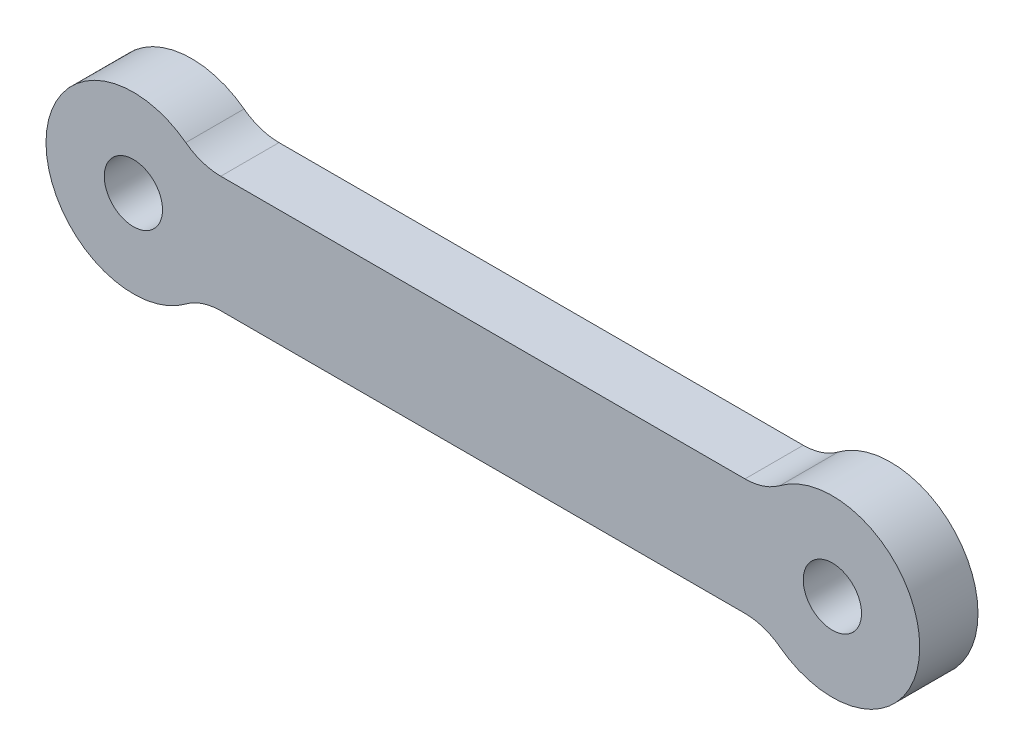
ISO-10303-21;
HEADER;
FILE_DESCRIPTION(('STEP AP214'),'2;1');
FILE_NAME('part.step','',(''),(''),'','','');
FILE_SCHEMA(('AUTOMOTIVE_DESIGN { 1 0 10303 214 1 1 1 1 }'));
ENDSEC;
DATA;
#1=APPLICATION_CONTEXT('core data for automotive mechanical design processes');
#2=APPLICATION_PROTOCOL_DEFINITION('international standard','automotive_design',2000,#1);
#3=PRODUCT_CONTEXT('',#1,'mechanical');
#4=PRODUCT('Part','Part','',(#3));
#5=PRODUCT_RELATED_PRODUCT_CATEGORY('part','',(#4));
#6=PRODUCT_DEFINITION_FORMATION('','',#4);
#7=PRODUCT_DEFINITION_CONTEXT('part definition',#1,'design');
#8=PRODUCT_DEFINITION('design','',#6,#7);
#9=PRODUCT_DEFINITION_SHAPE('','',#8);
#10=(LENGTH_UNIT() NAMED_UNIT(*) SI_UNIT(.MILLI.,.METRE.));
#11=(NAMED_UNIT(*) PLANE_ANGLE_UNIT() SI_UNIT($,.RADIAN.));
#12=(NAMED_UNIT(*) SI_UNIT($,.STERADIAN.) SOLID_ANGLE_UNIT());
#13=UNCERTAINTY_MEASURE_WITH_UNIT(LENGTH_MEASURE(1.E-05),#10,'distance_accuracy_value','');
#14=(GEOMETRIC_REPRESENTATION_CONTEXT(3) GLOBAL_UNCERTAINTY_ASSIGNED_CONTEXT((#13)) GLOBAL_UNIT_ASSIGNED_CONTEXT((#10,
#11,#12)) REPRESENTATION_CONTEXT('',''));
#15=CARTESIAN_POINT('',(0.,0.,0.));
#16=DIRECTION('',(0.,0.,1.));
#17=DIRECTION('',(1.,0.,0.));
#18=AXIS2_PLACEMENT_3D('',#15,#16,#17);
#19=CARTESIAN_POINT('',(-66.675,-12.7,3.175));
#20=DIRECTION('',(0.,0.,1.));
#21=DIRECTION('',(1.,0.,0.));
#22=AXIS2_PLACEMENT_3D('',#19,#20,#21);
#23=PLANE('',#22);
#24=CARTESIAN_POINT('',(0.,0.,3.175));
#25=DIRECTION('',(0.,0.,1.));
#26=DIRECTION('',(1.,0.,0.));
#27=AXIS2_PLACEMENT_3D('',#24,#25,#26);
#28=CIRCLE('',#27,3.175);
#29=CARTESIAN_POINT('',(3.175,0.,3.175));
#30=VERTEX_POINT('',#29);
#31=EDGE_CURVE('E134',#30,#30,#28,.T.);
#32=ORIENTED_EDGE('',*,*,#31,.F.);
#33=EDGE_LOOP('',(#32));
#34=FACE_BOUND('',#33,.T.);
#35=CARTESIAN_POINT('',(-66.675,-12.7,3.175));
#36=DIRECTION('',(0.,0.,-1.));
#37=DIRECTION('',(1.,0.,0.));
#38=AXIS2_PLACEMENT_3D('',#35,#36,#37);
#39=CIRCLE('',#38,6.35);
#40=CARTESIAN_POINT('',(-70.485,-7.62,3.175));
#41=VERTEX_POINT('',#40);
#42=CARTESIAN_POINT('',(-66.675,-6.35,3.175));
#43=VERTEX_POINT('',#42);
#44=EDGE_CURVE('E145',#41,#43,#39,.T.);
#45=ORIENTED_EDGE('',*,*,#44,.T.);
#46=DIRECTION('',(1.,0.,0.));
#47=VECTOR('',#46,1.);
#48=CARTESIAN_POINT('',(-9.525,-6.35,3.175));
#49=LINE('',#48,#47);
#50=CARTESIAN_POINT('',(-9.525,-6.35,3.175));
#51=VERTEX_POINT('',#50);
#52=EDGE_CURVE('E93',#43,#51,#49,.T.);
#53=ORIENTED_EDGE('',*,*,#52,.T.);
#54=CARTESIAN_POINT('',(-9.525,-12.7,3.175));
#55=DIRECTION('',(0.,0.,-1.));
#56=DIRECTION('',(-1.,0.,0.));
#57=AXIS2_PLACEMENT_3D('',#54,#55,#56);
#58=CIRCLE('',#57,6.35);
#59=CARTESIAN_POINT('',(-5.715,-7.62,3.175));
#60=VERTEX_POINT('',#59);
#61=EDGE_CURVE('E160',#51,#60,#58,.T.);
#62=ORIENTED_EDGE('',*,*,#61,.T.);
#63=CARTESIAN_POINT('',(0.,0.,3.175));
#64=DIRECTION('',(0.,0.,1.));
#65=DIRECTION('',(1.,0.,0.));
#66=AXIS2_PLACEMENT_3D('',#63,#64,#65);
#67=CIRCLE('',#66,9.525);
#68=CARTESIAN_POINT('',(-5.715,7.62,3.175));
#69=VERTEX_POINT('',#68);
#70=EDGE_CURVE('E173',#60,#69,#67,.T.);
#71=ORIENTED_EDGE('',*,*,#70,.T.);
#72=CARTESIAN_POINT('',(-9.525,12.7,3.175));
#73=DIRECTION('',(0.,0.,-1.));
#74=DIRECTION('',(1.,0.,0.));
#75=AXIS2_PLACEMENT_3D('',#72,#73,#74);
#76=CIRCLE('',#75,6.35);
#77=CARTESIAN_POINT('',(-9.525,6.35,3.175));
#78=VERTEX_POINT('',#77);
#79=EDGE_CURVE('E112',#69,#78,#76,.T.);
#80=ORIENTED_EDGE('',*,*,#79,.T.);
#81=DIRECTION('',(-1.,0.,0.));
#82=VECTOR('',#81,1.);
#83=CARTESIAN_POINT('',(-66.675,6.35,3.175));
#84=LINE('',#83,#82);
#85=CARTESIAN_POINT('',(-66.675,6.35,3.175));
#86=VERTEX_POINT('',#85);
#87=EDGE_CURVE('E106',#78,#86,#84,.T.);
#88=ORIENTED_EDGE('',*,*,#87,.T.);
#89=CARTESIAN_POINT('',(-66.675,12.7,3.175));
#90=DIRECTION('',(0.,0.,-1.));
#91=DIRECTION('',(-1.,0.,0.));
#92=AXIS2_PLACEMENT_3D('',#89,#90,#91);
#93=CIRCLE('',#92,6.35);
#94=CARTESIAN_POINT('',(-70.485,7.62,3.175));
#95=VERTEX_POINT('',#94);
#96=EDGE_CURVE('E110',#86,#95,#93,.T.);
#97=ORIENTED_EDGE('',*,*,#96,.T.);
#98=CARTESIAN_POINT('',(-76.2,0.,3.175));
#99=DIRECTION('',(0.,0.,1.));
#100=DIRECTION('',(1.,0.,0.));
#101=AXIS2_PLACEMENT_3D('',#98,#99,#100);
#102=CIRCLE('',#101,9.525);
#103=EDGE_CURVE('E50',#95,#41,#102,.T.);
#104=ORIENTED_EDGE('',*,*,#103,.T.);
#105=EDGE_LOOP('',(#45,#53,#62,#71,#80,#88,#97,#104));
#106=FACE_BOUND('',#105,.T.);
#107=CARTESIAN_POINT('',(-76.2,0.,3.175));
#108=DIRECTION('',(0.,0.,1.));
#109=DIRECTION('',(1.,0.,0.));
#110=AXIS2_PLACEMENT_3D('',#107,#108,#109);
#111=CIRCLE('',#110,3.175);
#112=CARTESIAN_POINT('',(-73.025,0.,3.175));
#113=VERTEX_POINT('',#112);
#114=EDGE_CURVE('E182',#113,#113,#111,.T.);
#115=ORIENTED_EDGE('',*,*,#114,.F.);
#116=EDGE_LOOP('',(#115));
#117=FACE_BOUND('',#116,.T.);
#118=ADVANCED_FACE('F33',(#34,#106,#117),#23,.T.);
#119=CARTESIAN_POINT('',(-66.675,-12.7,-3.175));
#120=DIRECTION('',(0.,0.,1.));
#121=DIRECTION('',(1.,0.,0.));
#122=AXIS2_PLACEMENT_3D('',#119,#120,#121);
#123=PLANE('',#122);
#124=CARTESIAN_POINT('',(-66.675,-12.7,-3.175));
#125=DIRECTION('',(0.,0.,-1.));
#126=DIRECTION('',(1.,0.,0.));
#127=AXIS2_PLACEMENT_3D('',#124,#125,#126);
#128=CIRCLE('',#127,6.35);
#129=CARTESIAN_POINT('',(-70.485,-7.62,-3.175));
#130=VERTEX_POINT('',#129);
#131=CARTESIAN_POINT('',(-66.675,-6.35,-3.175));
#132=VERTEX_POINT('',#131);
#133=EDGE_CURVE('E130',#130,#132,#128,.T.);
#134=ORIENTED_EDGE('',*,*,#133,.F.);
#135=CARTESIAN_POINT('',(-76.2,0.,-3.175));
#136=DIRECTION('',(0.,0.,1.));
#137=DIRECTION('',(1.,0.,0.));
#138=AXIS2_PLACEMENT_3D('',#135,#136,#137);
#139=CIRCLE('',#138,9.525);
#140=CARTESIAN_POINT('',(-70.485,7.62,-3.175));
#141=VERTEX_POINT('',#140);
#142=EDGE_CURVE('E85',#141,#130,#139,.T.);
#143=ORIENTED_EDGE('',*,*,#142,.F.);
#144=CARTESIAN_POINT('',(-66.675,12.7,-3.175));
#145=DIRECTION('',(0.,0.,-1.));
#146=DIRECTION('',(-1.,0.,0.));
#147=AXIS2_PLACEMENT_3D('',#144,#145,#146);
#148=CIRCLE('',#147,6.35);
#149=CARTESIAN_POINT('',(-66.675,6.35,-3.175));
#150=VERTEX_POINT('',#149);
#151=EDGE_CURVE('E79',#150,#141,#148,.T.);
#152=ORIENTED_EDGE('',*,*,#151,.F.);
#153=DIRECTION('',(-1.,0.,0.));
#154=VECTOR('',#153,1.);
#155=CARTESIAN_POINT('',(-66.675,6.35,-3.175));
#156=LINE('',#155,#154);
#157=CARTESIAN_POINT('',(-9.525,6.35,-3.175));
#158=VERTEX_POINT('',#157);
#159=EDGE_CURVE('E120',#158,#150,#156,.T.);
#160=ORIENTED_EDGE('',*,*,#159,.F.);
#161=CARTESIAN_POINT('',(-9.525,12.7,-3.175));
#162=DIRECTION('',(0.,0.,-1.));
#163=DIRECTION('',(1.,0.,0.));
#164=AXIS2_PLACEMENT_3D('',#161,#162,#163);
#165=CIRCLE('',#164,6.35);
#166=CARTESIAN_POINT('',(-5.715,7.62,-3.175));
#167=VERTEX_POINT('',#166);
#168=EDGE_CURVE('E140',#167,#158,#165,.T.);
#169=ORIENTED_EDGE('',*,*,#168,.F.);
#170=CARTESIAN_POINT('',(0.,0.,-3.175));
#171=DIRECTION('',(0.,0.,1.));
#172=DIRECTION('',(1.,0.,0.));
#173=AXIS2_PLACEMENT_3D('',#170,#171,#172);
#174=CIRCLE('',#173,9.525);
#175=CARTESIAN_POINT('',(-5.715,-7.62,-3.175));
#176=VERTEX_POINT('',#175);
#177=EDGE_CURVE('E138',#176,#167,#174,.T.);
#178=ORIENTED_EDGE('',*,*,#177,.F.);
#179=CARTESIAN_POINT('',(-9.525,-12.7,-3.175));
#180=DIRECTION('',(0.,0.,-1.));
#181=DIRECTION('',(-1.,0.,0.));
#182=AXIS2_PLACEMENT_3D('',#179,#180,#181);
#183=CIRCLE('',#182,6.35);
#184=CARTESIAN_POINT('',(-9.525,-6.35,-3.175));
#185=VERTEX_POINT('',#184);
#186=EDGE_CURVE('E136',#185,#176,#183,.T.);
#187=ORIENTED_EDGE('',*,*,#186,.F.);
#188=DIRECTION('',(1.,0.,0.));
#189=VECTOR('',#188,1.);
#190=CARTESIAN_POINT('',(-9.525,-6.35,-3.175));
#191=LINE('',#190,#189);
#192=EDGE_CURVE('E133',#132,#185,#191,.T.);
#193=ORIENTED_EDGE('',*,*,#192,.F.);
#194=EDGE_LOOP('',(#134,#143,#152,#160,#169,#178,#187,#193));
#195=FACE_BOUND('',#194,.T.);
#196=CARTESIAN_POINT('',(0.,0.,-3.175));
#197=DIRECTION('',(0.,0.,1.));
#198=DIRECTION('',(1.,0.,0.));
#199=AXIS2_PLACEMENT_3D('',#196,#197,#198);
#200=CIRCLE('',#199,3.175);
#201=CARTESIAN_POINT('',(3.175,0.,-3.175));
#202=VERTEX_POINT('',#201);
#203=EDGE_CURVE('E179',#202,#202,#200,.T.);
#204=ORIENTED_EDGE('',*,*,#203,.T.);
#205=EDGE_LOOP('',(#204));
#206=FACE_BOUND('',#205,.T.);
#207=CARTESIAN_POINT('',(-76.2,0.,-3.175));
#208=DIRECTION('',(0.,0.,1.));
#209=DIRECTION('',(1.,0.,0.));
#210=AXIS2_PLACEMENT_3D('',#207,#208,#209);
#211=CIRCLE('',#210,3.175);
#212=CARTESIAN_POINT('',(-73.025,0.,-3.175));
#213=VERTEX_POINT('',#212);
#214=EDGE_CURVE('E185',#213,#213,#211,.T.);
#215=ORIENTED_EDGE('',*,*,#214,.T.);
#216=EDGE_LOOP('',(#215));
#217=FACE_BOUND('',#216,.T.);
#218=ADVANCED_FACE('F164',(#195,#206,#217),#123,.F.);
#219=CARTESIAN_POINT('',(-66.675,-12.7,3.175));
#220=DIRECTION('',(0.,0.,-1.));
#221=DIRECTION('',(-1.,0.,0.));
#222=AXIS2_PLACEMENT_3D('',#219,#220,#221);
#223=CYLINDRICAL_SURFACE('',#222,6.35);
#224=ORIENTED_EDGE('',*,*,#133,.T.);
#225=DIRECTION('',(0.,0.,-1.));
#226=VECTOR('',#225,1.);
#227=CARTESIAN_POINT('',(-66.675,-6.35,3.175));
#228=LINE('',#227,#226);
#229=EDGE_CURVE('E11',#43,#132,#228,.T.);
#230=ORIENTED_EDGE('',*,*,#229,.F.);
#231=ORIENTED_EDGE('',*,*,#44,.F.);
#232=DIRECTION('',(0.,0.,-1.));
#233=VECTOR('',#232,1.);
#234=CARTESIAN_POINT('',(-70.485,-7.62,3.175));
#235=LINE('',#234,#233);
#236=EDGE_CURVE('E126',#41,#130,#235,.T.);
#237=ORIENTED_EDGE('',*,*,#236,.T.);
#238=EDGE_LOOP('',(#224,#230,#231,#237));
#239=FACE_BOUND('',#238,.T.);
#240=ADVANCED_FACE('F35',(#239),#223,.F.);
#241=CARTESIAN_POINT('',(-9.525,-6.35,3.175));
#242=DIRECTION('',(0.,1.,0.));
#243=DIRECTION('',(0.,0.,1.));
#244=AXIS2_PLACEMENT_3D('',#241,#242,#243);
#245=PLANE('',#244);
#246=ORIENTED_EDGE('',*,*,#192,.T.);
#247=DIRECTION('',(0.,0.,-1.));
#248=VECTOR('',#247,1.);
#249=CARTESIAN_POINT('',(-9.525,-6.35,3.175));
#250=LINE('',#249,#248);
#251=EDGE_CURVE('E42',#51,#185,#250,.T.);
#252=ORIENTED_EDGE('',*,*,#251,.F.);
#253=ORIENTED_EDGE('',*,*,#52,.F.);
#254=ORIENTED_EDGE('',*,*,#229,.T.);
#255=EDGE_LOOP('',(#246,#252,#253,#254));
#256=FACE_BOUND('',#255,.T.);
#257=ADVANCED_FACE('F217',(#256),#245,.F.);
#258=CARTESIAN_POINT('',(-9.525,-12.7,3.175));
#259=DIRECTION('',(0.,0.,-1.));
#260=DIRECTION('',(-1.,0.,0.));
#261=AXIS2_PLACEMENT_3D('',#258,#259,#260);
#262=CYLINDRICAL_SURFACE('',#261,6.35);
#263=ORIENTED_EDGE('',*,*,#186,.T.);
#264=DIRECTION('',(0.,0.,-1.));
#265=VECTOR('',#264,1.);
#266=CARTESIAN_POINT('',(-5.715,-7.62,3.175));
#267=LINE('',#266,#265);
#268=EDGE_CURVE('E152',#60,#176,#267,.T.);
#269=ORIENTED_EDGE('',*,*,#268,.F.);
#270=ORIENTED_EDGE('',*,*,#61,.F.);
#271=ORIENTED_EDGE('',*,*,#251,.T.);
#272=EDGE_LOOP('',(#263,#269,#270,#271));
#273=FACE_BOUND('',#272,.T.);
#274=ADVANCED_FACE('F158',(#273),#262,.F.);
#275=CARTESIAN_POINT('',(0.,0.,3.175));
#276=DIRECTION('',(0.,0.,-1.));
#277=DIRECTION('',(-1.,0.,0.));
#278=AXIS2_PLACEMENT_3D('',#275,#276,#277);
#279=CYLINDRICAL_SURFACE('',#278,9.525);
#280=ORIENTED_EDGE('',*,*,#177,.T.);
#281=DIRECTION('',(0.,0.,-1.));
#282=VECTOR('',#281,1.);
#283=CARTESIAN_POINT('',(-5.715,7.62,3.175));
#284=LINE('',#283,#282);
#285=EDGE_CURVE('E149',#69,#167,#284,.T.);
#286=ORIENTED_EDGE('',*,*,#285,.F.);
#287=ORIENTED_EDGE('',*,*,#70,.F.);
#288=ORIENTED_EDGE('',*,*,#268,.T.);
#289=EDGE_LOOP('',(#280,#286,#287,#288));
#290=FACE_BOUND('',#289,.T.);
#291=ADVANCED_FACE('F169',(#290),#279,.T.);
#292=CARTESIAN_POINT('',(-9.525,12.7,3.175));
#293=DIRECTION('',(0.,0.,-1.));
#294=DIRECTION('',(-1.,0.,0.));
#295=AXIS2_PLACEMENT_3D('',#292,#293,#294);
#296=CYLINDRICAL_SURFACE('',#295,6.35);
#297=ORIENTED_EDGE('',*,*,#168,.T.);
#298=DIRECTION('',(0.,0.,-1.));
#299=VECTOR('',#298,1.);
#300=CARTESIAN_POINT('',(-9.525,6.35,3.175));
#301=LINE('',#300,#299);
#302=EDGE_CURVE('E121',#78,#158,#301,.T.);
#303=ORIENTED_EDGE('',*,*,#302,.F.);
#304=ORIENTED_EDGE('',*,*,#79,.F.);
#305=ORIENTED_EDGE('',*,*,#285,.T.);
#306=EDGE_LOOP('',(#297,#303,#304,#305));
#307=FACE_BOUND('',#306,.T.);
#308=ADVANCED_FACE('F172',(#307),#296,.F.);
#309=CARTESIAN_POINT('',(-66.675,6.35,3.175));
#310=DIRECTION('',(0.,-1.,0.));
#311=DIRECTION('',(1.,0.,0.));
#312=AXIS2_PLACEMENT_3D('',#309,#310,#311);
#313=PLANE('',#312);
#314=ORIENTED_EDGE('',*,*,#159,.T.);
#315=DIRECTION('',(0.,0.,-1.));
#316=VECTOR('',#315,1.);
#317=CARTESIAN_POINT('',(-66.675,6.35,3.175));
#318=LINE('',#317,#316);
#319=EDGE_CURVE('E117',#86,#150,#318,.T.);
#320=ORIENTED_EDGE('',*,*,#319,.F.);
#321=ORIENTED_EDGE('',*,*,#87,.F.);
#322=ORIENTED_EDGE('',*,*,#302,.T.);
#323=EDGE_LOOP('',(#314,#320,#321,#322));
#324=FACE_BOUND('',#323,.T.);
#325=ADVANCED_FACE('F118',(#324),#313,.F.);
#326=CARTESIAN_POINT('',(-66.675,12.7,3.175));
#327=DIRECTION('',(0.,0.,-1.));
#328=DIRECTION('',(-1.,0.,0.));
#329=AXIS2_PLACEMENT_3D('',#326,#327,#328);
#330=CYLINDRICAL_SURFACE('',#329,6.35);
#331=ORIENTED_EDGE('',*,*,#151,.T.);
#332=DIRECTION('',(0.,0.,-1.));
#333=VECTOR('',#332,1.);
#334=CARTESIAN_POINT('',(-70.485,7.62,3.175));
#335=LINE('',#334,#333);
#336=EDGE_CURVE('E122',#95,#141,#335,.T.);
#337=ORIENTED_EDGE('',*,*,#336,.F.);
#338=ORIENTED_EDGE('',*,*,#96,.F.);
#339=ORIENTED_EDGE('',*,*,#319,.T.);
#340=EDGE_LOOP('',(#331,#337,#338,#339));
#341=FACE_BOUND('',#340,.T.);
#342=ADVANCED_FACE('F124',(#341),#330,.F.);
#343=CARTESIAN_POINT('',(-76.2,0.,3.175));
#344=DIRECTION('',(0.,0.,-1.));
#345=DIRECTION('',(-1.,0.,0.));
#346=AXIS2_PLACEMENT_3D('',#343,#344,#345);
#347=CYLINDRICAL_SURFACE('',#346,9.525);
#348=ORIENTED_EDGE('',*,*,#142,.T.);
#349=ORIENTED_EDGE('',*,*,#236,.F.);
#350=ORIENTED_EDGE('',*,*,#103,.F.);
#351=ORIENTED_EDGE('',*,*,#336,.T.);
#352=EDGE_LOOP('',(#348,#349,#350,#351));
#353=FACE_BOUND('',#352,.T.);
#354=ADVANCED_FACE('F205',(#353),#347,.T.);
#355=CARTESIAN_POINT('',(0.,0.,3.175));
#356=DIRECTION('',(0.,0.,-1.));
#357=DIRECTION('',(-1.,0.,0.));
#358=AXIS2_PLACEMENT_3D('',#355,#356,#357);
#359=CYLINDRICAL_SURFACE('',#358,3.175);
#360=ORIENTED_EDGE('',*,*,#31,.T.);
#361=EDGE_LOOP('',(#360));
#362=FACE_BOUND('',#361,.T.);
#363=ORIENTED_EDGE('',*,*,#203,.F.);
#364=EDGE_LOOP('',(#363));
#365=FACE_BOUND('',#364,.T.);
#366=ADVANCED_FACE('F202',(#362,#365),#359,.F.);
#367=CARTESIAN_POINT('',(-76.2,0.,3.175));
#368=DIRECTION('',(0.,0.,-1.));
#369=DIRECTION('',(-1.,0.,0.));
#370=AXIS2_PLACEMENT_3D('',#367,#368,#369);
#371=CYLINDRICAL_SURFACE('',#370,3.175);
#372=ORIENTED_EDGE('',*,*,#114,.T.);
#373=EDGE_LOOP('',(#372));
#374=FACE_BOUND('',#373,.T.);
#375=ORIENTED_EDGE('',*,*,#214,.F.);
#376=EDGE_LOOP('',(#375));
#377=FACE_BOUND('',#376,.T.);
#378=ADVANCED_FACE('F191',(#374,#377),#371,.F.);
#379=CLOSED_SHELL('',(#118,#218,#240,#257,#274,#291,#308,#325,#342,#354,#366,#378));
#380=MANIFOLD_SOLID_BREP('B2',#379);
#381=ADVANCED_BREP_SHAPE_REPRESENTATION('',(#18,#380),#14);
#382=SHAPE_DEFINITION_REPRESENTATION(#9,#381);
ENDSEC;
END-ISO-10303-21;
